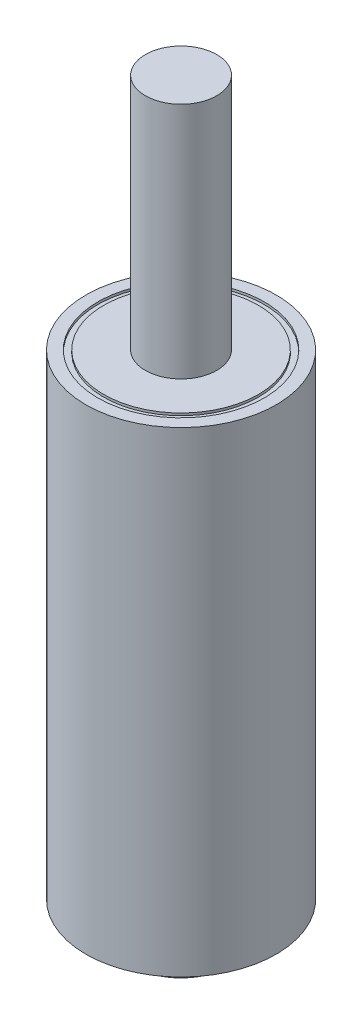
ISO-10303-21;
HEADER;
FILE_DESCRIPTION(('STEP AP214'),'2;1');
FILE_NAME('part.step','',(''),(''),'','','');
FILE_SCHEMA(('AUTOMOTIVE_DESIGN { 1 0 10303 214 1 1 1 1 }'));
ENDSEC;
DATA;
#1=APPLICATION_CONTEXT('core data for automotive mechanical design processes');
#2=APPLICATION_PROTOCOL_DEFINITION('international standard','automotive_design',2000,#1);
#3=PRODUCT_CONTEXT('',#1,'mechanical');
#4=PRODUCT('Part','Part','',(#3));
#5=PRODUCT_RELATED_PRODUCT_CATEGORY('part','',(#4));
#6=PRODUCT_DEFINITION_FORMATION('','',#4);
#7=PRODUCT_DEFINITION_CONTEXT('part definition',#1,'design');
#8=PRODUCT_DEFINITION('design','',#6,#7);
#9=PRODUCT_DEFINITION_SHAPE('','',#8);
#10=(LENGTH_UNIT() NAMED_UNIT(*) SI_UNIT(.MILLI.,.METRE.));
#11=(NAMED_UNIT(*) PLANE_ANGLE_UNIT() SI_UNIT($,.RADIAN.));
#12=(NAMED_UNIT(*) SI_UNIT($,.STERADIAN.) SOLID_ANGLE_UNIT());
#13=UNCERTAINTY_MEASURE_WITH_UNIT(LENGTH_MEASURE(1.E-05),#10,'distance_accuracy_value','');
#14=(GEOMETRIC_REPRESENTATION_CONTEXT(3) GLOBAL_UNCERTAINTY_ASSIGNED_CONTEXT((#13)) GLOBAL_UNIT_ASSIGNED_CONTEXT((#10,
#11,#12)) REPRESENTATION_CONTEXT('',''));
#15=CARTESIAN_POINT('',(0.,0.,0.));
#16=DIRECTION('',(0.,0.,1.));
#17=DIRECTION('',(1.,0.,0.));
#18=AXIS2_PLACEMENT_3D('',#15,#16,#17);
#19=CARTESIAN_POINT('',(0.,20.,0.));
#20=DIRECTION('',(0.,1.,0.));
#21=DIRECTION('',(0.,0.,1.));
#22=AXIS2_PLACEMENT_3D('',#19,#20,#21);
#23=PLANE('',#22);
#24=CARTESIAN_POINT('',(0.,20.,0.));
#25=DIRECTION('',(0.,1.,0.));
#26=DIRECTION('',(0.,0.,1.));
#27=AXIS2_PLACEMENT_3D('',#24,#25,#26);
#28=CIRCLE('',#27,3.5);
#29=CARTESIAN_POINT('',(0.,20.,3.5));
#30=VERTEX_POINT('',#29);
#31=EDGE_CURVE('E210',#30,#30,#28,.T.);
#32=ORIENTED_EDGE('',*,*,#31,.F.);
#33=EDGE_LOOP('',(#32));
#34=FACE_BOUND('',#33,.T.);
#35=CARTESIAN_POINT('',(0.,20.,0.));
#36=DIRECTION('',(0.,1.,0.));
#37=DIRECTION('',(0.,0.,1.));
#38=AXIS2_PLACEMENT_3D('',#35,#36,#37);
#39=CIRCLE('',#38,4.);
#40=CARTESIAN_POINT('',(0.,20.,4.));
#41=VERTEX_POINT('',#40);
#42=EDGE_CURVE('E141',#41,#41,#39,.T.);
#43=ORIENTED_EDGE('',*,*,#42,.T.);
#44=EDGE_LOOP('',(#43));
#45=FACE_BOUND('',#44,.T.);
#46=ADVANCED_FACE('F48',(#34,#45),#23,.T.);
#47=CARTESIAN_POINT('',(0.,-1.2,0.));
#48=DIRECTION('',(0.,-1.,0.));
#49=DIRECTION('',(0.,0.,-1.));
#50=AXIS2_PLACEMENT_3D('',#47,#48,#49);
#51=PLANE('',#50);
#52=CARTESIAN_POINT('',(0.,-1.2,0.));
#53=DIRECTION('',(0.,-1.,0.));
#54=DIRECTION('',(0.,0.,-1.));
#55=AXIS2_PLACEMENT_3D('',#52,#53,#54);
#56=CIRCLE('',#55,1.25);
#57=CARTESIAN_POINT('',(0.,-1.2,-1.25));
#58=VERTEX_POINT('',#57);
#59=CARTESIAN_POINT('',(1.25,-1.2,0.));
#60=VERTEX_POINT('',#59);
#61=EDGE_CURVE('E117',#58,#60,#56,.T.);
#62=ORIENTED_EDGE('',*,*,#61,.F.);
#63=DIRECTION('',(0.,0.,1.));
#64=VECTOR('',#63,1.);
#65=CARTESIAN_POINT('',(0.,-1.2,-1.25));
#66=LINE('',#65,#64);
#67=CARTESIAN_POINT('',(0.,-1.2,-1.9));
#68=VERTEX_POINT('',#67);
#69=EDGE_CURVE('E226',#68,#58,#66,.T.);
#70=ORIENTED_EDGE('',*,*,#69,.F.);
#71=CARTESIAN_POINT('',(0.,-1.2,0.));
#72=DIRECTION('',(0.,-1.,0.));
#73=DIRECTION('',(0.,0.,-1.));
#74=AXIS2_PLACEMENT_3D('',#71,#72,#73);
#75=CIRCLE('',#74,1.9);
#76=CARTESIAN_POINT('',(1.9,-1.2,0.));
#77=VERTEX_POINT('',#76);
#78=EDGE_CURVE('E155',#68,#77,#75,.T.);
#79=ORIENTED_EDGE('',*,*,#78,.T.);
#80=DIRECTION('',(1.,0.,0.));
#81=VECTOR('',#80,1.);
#82=CARTESIAN_POINT('',(1.25,-1.2,0.));
#83=LINE('',#82,#81);
#84=EDGE_CURVE('E111',#60,#77,#83,.T.);
#85=ORIENTED_EDGE('',*,*,#84,.F.);
#86=EDGE_LOOP('',(#62,#70,#79,#85));
#87=FACE_BOUND('',#86,.T.);
#88=ADVANCED_FACE('F176',(#87),#51,.T.);
#89=CARTESIAN_POINT('',(0.,-1.7,0.));
#90=DIRECTION('',(0.,1.,0.));
#91=DIRECTION('',(0.,0.,1.));
#92=AXIS2_PLACEMENT_3D('',#89,#90,#91);
#93=CYLINDRICAL_SURFACE('',#92,1.25);
#94=CARTESIAN_POINT('',(0.,-1.5,0.));
#95=DIRECTION('',(0.,-1.,0.));
#96=DIRECTION('',(0.,0.,-1.));
#97=AXIS2_PLACEMENT_3D('',#94,#95,#96);
#98=CIRCLE('',#97,1.25);
#99=CARTESIAN_POINT('',(0.,-1.5,-1.25));
#100=VERTEX_POINT('',#99);
#101=EDGE_CURVE('E12',#100,#100,#98,.F.);
#102=ORIENTED_EDGE('',*,*,#101,.T.);
#103=EDGE_LOOP('',(#102));
#104=FACE_BOUND('',#103,.T.);
#105=DIRECTION('',(0.,1.,0.));
#106=VECTOR('',#105,1.);
#107=CARTESIAN_POINT('',(0.,-1.45,-1.25));
#108=LINE('',#107,#106);
#109=CARTESIAN_POINT('',(0.,-1.45,-1.25));
#110=VERTEX_POINT('',#109);
#111=EDGE_CURVE('E63',#110,#58,#108,.T.);
#112=ORIENTED_EDGE('',*,*,#111,.T.);
#113=ORIENTED_EDGE('',*,*,#61,.T.);
#114=DIRECTION('',(0.,1.,0.));
#115=VECTOR('',#114,1.);
#116=CARTESIAN_POINT('',(1.25,-1.45,0.));
#117=LINE('',#116,#115);
#118=CARTESIAN_POINT('',(1.25,-1.45,0.));
#119=VERTEX_POINT('',#118);
#120=EDGE_CURVE('E119',#119,#60,#117,.T.);
#121=ORIENTED_EDGE('',*,*,#120,.F.);
#122=CARTESIAN_POINT('',(0.,-1.45,0.));
#123=DIRECTION('',(0.,1.,0.));
#124=DIRECTION('',(0.,0.,-1.));
#125=AXIS2_PLACEMENT_3D('',#122,#123,#124);
#126=CIRCLE('',#125,1.25);
#127=EDGE_CURVE('E101',#110,#119,#126,.T.);
#128=ORIENTED_EDGE('',*,*,#127,.F.);
#129=EDGE_LOOP('',(#112,#113,#121,#128));
#130=FACE_BOUND('',#129,.T.);
#131=ADVANCED_FACE('F183',(#104,#130),#93,.T.);
#132=CARTESIAN_POINT('',(0.,0.,0.));
#133=DIRECTION('',(0.,1.,0.));
#134=DIRECTION('',(0.,0.,1.));
#135=AXIS2_PLACEMENT_3D('',#132,#133,#134);
#136=PLANE('',#135);
#137=CARTESIAN_POINT('',(0.,0.,0.));
#138=DIRECTION('',(0.,-1.,0.));
#139=DIRECTION('',(1.,0.,0.));
#140=AXIS2_PLACEMENT_3D('',#137,#138,#139);
#141=CIRCLE('',#140,3.25);
#142=CARTESIAN_POINT('',(3.25,0.,0.));
#143=VERTEX_POINT('',#142);
#144=EDGE_CURVE('E128',#143,#143,#141,.T.);
#145=ORIENTED_EDGE('',*,*,#144,.T.);
#146=EDGE_LOOP('',(#145));
#147=FACE_BOUND('',#146,.T.);
#148=CARTESIAN_POINT('',(0.,0.,0.));
#149=DIRECTION('',(0.,1.,0.));
#150=DIRECTION('',(0.,0.,1.));
#151=AXIS2_PLACEMENT_3D('',#148,#149,#150);
#152=CIRCLE('',#151,2.);
#153=CARTESIAN_POINT('',(0.,0.,2.));
#154=VERTEX_POINT('',#153);
#155=EDGE_CURVE('E144',#154,#154,#152,.F.);
#156=ORIENTED_EDGE('',*,*,#155,.F.);
#157=EDGE_LOOP('',(#156));
#158=FACE_BOUND('',#157,.T.);
#159=ADVANCED_FACE('F241',(#147,#158),#136,.F.);
#160=CARTESIAN_POINT('',(0.,20.,0.));
#161=DIRECTION('',(0.,-1.,0.));
#162=DIRECTION('',(0.,0.,-1.));
#163=AXIS2_PLACEMENT_3D('',#160,#161,#162);
#164=CYLINDRICAL_SURFACE('',#163,4.);
#165=ORIENTED_EDGE('',*,*,#42,.F.);
#166=EDGE_LOOP('',(#165));
#167=FACE_BOUND('',#166,.T.);
#168=CARTESIAN_POINT('',(0.,0.,0.));
#169=DIRECTION('',(0.,1.,0.));
#170=DIRECTION('',(0.,0.,1.));
#171=AXIS2_PLACEMENT_3D('',#168,#169,#170);
#172=CIRCLE('',#171,4.);
#173=CARTESIAN_POINT('',(0.,0.,4.));
#174=VERTEX_POINT('',#173);
#175=EDGE_CURVE('E138',#174,#174,#172,.T.);
#176=ORIENTED_EDGE('',*,*,#175,.T.);
#177=EDGE_LOOP('',(#176));
#178=FACE_BOUND('',#177,.T.);
#179=ADVANCED_FACE('F247',(#167,#178),#164,.T.);
#180=CARTESIAN_POINT('',(0.,0.,0.));
#181=DIRECTION('',(0.,-1.,0.));
#182=DIRECTION('',(0.,0.,-1.));
#183=AXIS2_PLACEMENT_3D('',#180,#181,#182);
#184=CIRCLE('',#183,3.5);
#185=CARTESIAN_POINT('',(0.,0.,-3.5));
#186=VERTEX_POINT('',#185);
#187=EDGE_CURVE('E132',#186,#186,#184,.T.);
#188=ORIENTED_EDGE('',*,*,#187,.F.);
#189=EDGE_LOOP('',(#188));
#190=FACE_BOUND('',#189,.T.);
#191=ORIENTED_EDGE('',*,*,#175,.F.);
#192=EDGE_LOOP('',(#191));
#193=FACE_BOUND('',#192,.T.);
#194=ADVANCED_FACE('F249',(#190,#193),#136,.F.);
#195=CARTESIAN_POINT('',(0.,0.1,0.));
#196=DIRECTION('',(0.,-1.,0.));
#197=DIRECTION('',(0.,0.,-1.));
#198=AXIS2_PLACEMENT_3D('',#195,#196,#197);
#199=CYLINDRICAL_SURFACE('',#198,3.5);
#200=CARTESIAN_POINT('',(0.,0.1,0.));
#201=DIRECTION('',(0.,-1.,0.));
#202=DIRECTION('',(0.,0.,-1.));
#203=AXIS2_PLACEMENT_3D('',#200,#201,#202);
#204=CIRCLE('',#203,3.5);
#205=CARTESIAN_POINT('',(0.,0.1,-3.5));
#206=VERTEX_POINT('',#205);
#207=EDGE_CURVE('E135',#206,#206,#204,.T.);
#208=ORIENTED_EDGE('',*,*,#207,.F.);
#209=EDGE_LOOP('',(#208));
#210=FACE_BOUND('',#209,.T.);
#211=ORIENTED_EDGE('',*,*,#187,.T.);
#212=EDGE_LOOP('',(#211));
#213=FACE_BOUND('',#212,.T.);
#214=ADVANCED_FACE('F270',(#210,#213),#199,.F.);
#215=CARTESIAN_POINT('',(0.,0.1,0.));
#216=DIRECTION('',(0.,-1.,0.));
#217=DIRECTION('',(0.,0.,-1.));
#218=AXIS2_PLACEMENT_3D('',#215,#216,#217);
#219=PLANE('',#218);
#220=CARTESIAN_POINT('',(0.,0.1,0.));
#221=DIRECTION('',(0.,-1.,0.));
#222=DIRECTION('',(1.,0.,0.));
#223=AXIS2_PLACEMENT_3D('',#220,#221,#222);
#224=CIRCLE('',#223,3.25);
#225=CARTESIAN_POINT('',(3.25,0.1,0.));
#226=VERTEX_POINT('',#225);
#227=EDGE_CURVE('E129',#226,#226,#224,.T.);
#228=ORIENTED_EDGE('',*,*,#227,.F.);
#229=EDGE_LOOP('',(#228));
#230=FACE_BOUND('',#229,.T.);
#231=ORIENTED_EDGE('',*,*,#207,.T.);
#232=EDGE_LOOP('',(#231));
#233=FACE_BOUND('',#232,.T.);
#234=ADVANCED_FACE('F267',(#230,#233),#219,.T.);
#235=CARTESIAN_POINT('',(0.,0.1,0.));
#236=DIRECTION('',(0.,-1.,0.));
#237=DIRECTION('',(0.,0.,-1.));
#238=AXIS2_PLACEMENT_3D('',#235,#236,#237);
#239=CYLINDRICAL_SURFACE('',#238,3.25);
#240=ORIENTED_EDGE('',*,*,#227,.T.);
#241=EDGE_LOOP('',(#240));
#242=FACE_BOUND('',#241,.T.);
#243=ORIENTED_EDGE('',*,*,#144,.F.);
#244=EDGE_LOOP('',(#243));
#245=FACE_BOUND('',#244,.T.);
#246=ADVANCED_FACE('F263',(#242,#245),#239,.T.);
#247=CARTESIAN_POINT('',(0.,-0.2,0.));
#248=DIRECTION('',(0.,1.,0.));
#249=DIRECTION('',(0.,0.,1.));
#250=AXIS2_PLACEMENT_3D('',#247,#248,#249);
#251=CYLINDRICAL_SURFACE('',#250,2.);
#252=CARTESIAN_POINT('',(0.,-0.1,0.));
#253=DIRECTION('',(0.,-1.,0.));
#254=DIRECTION('',(0.,0.,-1.));
#255=AXIS2_PLACEMENT_3D('',#252,#253,#254);
#256=CIRCLE('',#255,2.);
#257=CARTESIAN_POINT('',(0.,-0.1,-2.));
#258=VERTEX_POINT('',#257);
#259=EDGE_CURVE('E152',#258,#258,#256,.F.);
#260=ORIENTED_EDGE('',*,*,#259,.T.);
#261=EDGE_LOOP('',(#260));
#262=FACE_BOUND('',#261,.T.);
#263=ORIENTED_EDGE('',*,*,#155,.T.);
#264=EDGE_LOOP('',(#263));
#265=FACE_BOUND('',#264,.T.);
#266=ADVANCED_FACE('F260',(#262,#265),#251,.T.);
#267=CARTESIAN_POINT('',(0.,-0.1,0.));
#268=DIRECTION('',(0.,-1.,0.));
#269=DIRECTION('',(0.,0.,-1.));
#270=AXIS2_PLACEMENT_3D('',#267,#268,#269);
#271=TOROIDAL_SURFACE('',#270,1.9,0.1);
#272=ORIENTED_EDGE('',*,*,#259,.F.);
#273=EDGE_LOOP('',(#272));
#274=FACE_BOUND('',#273,.T.);
#275=CARTESIAN_POINT('',(0.,-0.2,0.));
#276=DIRECTION('',(0.,-1.,0.));
#277=DIRECTION('',(0.,0.,-1.));
#278=AXIS2_PLACEMENT_3D('',#275,#276,#277);
#279=CIRCLE('',#278,1.9);
#280=CARTESIAN_POINT('',(0.,-0.2,-1.9));
#281=VERTEX_POINT('',#280);
#282=EDGE_CURVE('E149',#281,#281,#279,.T.);
#283=ORIENTED_EDGE('',*,*,#282,.F.);
#284=EDGE_LOOP('',(#283));
#285=FACE_BOUND('',#284,.T.);
#286=ADVANCED_FACE('F258',(#274,#285),#271,.T.);
#287=CARTESIAN_POINT('',(0.,-1.2,0.));
#288=DIRECTION('',(0.,1.,0.));
#289=DIRECTION('',(0.,0.,1.));
#290=AXIS2_PLACEMENT_3D('',#287,#288,#289);
#291=CYLINDRICAL_SURFACE('',#290,2.);
#292=CARTESIAN_POINT('',(0.,-1.1,0.));
#293=DIRECTION('',(0.,-1.,0.));
#294=DIRECTION('',(0.,0.,-1.));
#295=AXIS2_PLACEMENT_3D('',#292,#293,#294);
#296=CIRCLE('',#295,2.);
#297=CARTESIAN_POINT('',(0.,-1.1,-2.));
#298=VERTEX_POINT('',#297);
#299=EDGE_CURVE('E158',#298,#298,#296,.F.);
#300=ORIENTED_EDGE('',*,*,#299,.T.);
#301=EDGE_LOOP('',(#300));
#302=FACE_BOUND('',#301,.T.);
#303=CARTESIAN_POINT('',(0.,-0.2,0.));
#304=DIRECTION('',(0.,-1.,0.));
#305=DIRECTION('',(0.,0.,-1.));
#306=AXIS2_PLACEMENT_3D('',#303,#304,#305);
#307=CIRCLE('',#306,2.);
#308=CARTESIAN_POINT('',(0.,-0.2,-2.));
#309=VERTEX_POINT('',#308);
#310=EDGE_CURVE('E125',#309,#309,#307,.T.);
#311=ORIENTED_EDGE('',*,*,#310,.T.);
#312=EDGE_LOOP('',(#311));
#313=FACE_BOUND('',#312,.T.);
#314=ADVANCED_FACE('F254',(#302,#313),#291,.T.);
#315=CARTESIAN_POINT('',(0.,-0.2,0.));
#316=DIRECTION('',(0.,-1.,0.));
#317=DIRECTION('',(0.,0.,-1.));
#318=AXIS2_PLACEMENT_3D('',#315,#316,#317);
#319=PLANE('',#318);
#320=ORIENTED_EDGE('',*,*,#282,.T.);
#321=EDGE_LOOP('',(#320));
#322=FACE_BOUND('',#321,.T.);
#323=ORIENTED_EDGE('',*,*,#310,.F.);
#324=EDGE_LOOP('',(#323));
#325=FACE_BOUND('',#324,.T.);
#326=ADVANCED_FACE('F251',(#322,#325),#319,.F.);
#327=CARTESIAN_POINT('',(0.,-1.1,0.));
#328=DIRECTION('',(0.,-1.,0.));
#329=DIRECTION('',(0.,0.,-1.));
#330=AXIS2_PLACEMENT_3D('',#327,#328,#329);
#331=TOROIDAL_SURFACE('',#330,1.9,0.1);
#332=ORIENTED_EDGE('',*,*,#299,.F.);
#333=EDGE_LOOP('',(#332));
#334=FACE_BOUND('',#333,.T.);
#335=ORIENTED_EDGE('',*,*,#78,.F.);
#336=CARTESIAN_POINT('',(0.,-1.2,0.));
#337=DIRECTION('',(0.,-1.,0.));
#338=DIRECTION('',(0.,0.,-1.));
#339=AXIS2_PLACEMENT_3D('',#336,#337,#338);
#340=CIRCLE('',#339,1.9);
#341=EDGE_CURVE('E71',#68,#77,#340,.F.);
#342=ORIENTED_EDGE('',*,*,#341,.T.);
#343=EDGE_LOOP('',(#335,#342));
#344=FACE_BOUND('',#343,.T.);
#345=ADVANCED_FACE('F172',(#334,#344),#331,.T.);
#346=CARTESIAN_POINT('',(0.,-1.7,0.));
#347=DIRECTION('',(0.,-1.,0.));
#348=DIRECTION('',(0.,0.,-1.));
#349=AXIS2_PLACEMENT_3D('',#346,#347,#348);
#350=PLANE('',#349);
#351=CARTESIAN_POINT('',(0.,-1.7,0.));
#352=DIRECTION('',(0.,-1.,0.));
#353=DIRECTION('',(0.,0.,-1.));
#354=AXIS2_PLACEMENT_3D('',#351,#352,#353);
#355=CIRCLE('',#354,1.05);
#356=CARTESIAN_POINT('',(0.,-1.7,-1.05));
#357=VERTEX_POINT('',#356);
#358=EDGE_CURVE('E56',#357,#357,#355,.T.);
#359=ORIENTED_EDGE('',*,*,#358,.T.);
#360=EDGE_LOOP('',(#359));
#361=FACE_BOUND('',#360,.T.);
#362=ADVANCED_FACE('F163',(#361),#350,.T.);
#363=CARTESIAN_POINT('',(0.,-1.7,0.));
#364=DIRECTION('',(0.,1.,0.));
#365=DIRECTION('',(0.,0.,1.));
#366=AXIS2_PLACEMENT_3D('',#363,#364,#365);
#367=CONICAL_SURFACE('',#366,1.05,0.785398163397447);
#368=ORIENTED_EDGE('',*,*,#101,.F.);
#369=EDGE_LOOP('',(#368));
#370=FACE_BOUND('',#369,.T.);
#371=ORIENTED_EDGE('',*,*,#358,.F.);
#372=EDGE_LOOP('',(#371));
#373=FACE_BOUND('',#372,.T.);
#374=ADVANCED_FACE('F50',(#370,#373),#367,.T.);
#375=CARTESIAN_POINT('',(0.,-1.45,0.));
#376=DIRECTION('',(0.,1.,0.));
#377=DIRECTION('',(0.,0.,1.));
#378=AXIS2_PLACEMENT_3D('',#375,#376,#377);
#379=CYLINDRICAL_SURFACE('',#378,2.);
#380=CARTESIAN_POINT('',(0.,-1.2,0.));
#381=DIRECTION('',(0.,-1.,0.));
#382=DIRECTION('',(0.,0.,-1.));
#383=AXIS2_PLACEMENT_3D('',#380,#381,#382);
#384=CIRCLE('',#383,2.);
#385=CARTESIAN_POINT('',(2.,-1.2,0.));
#386=VERTEX_POINT('',#385);
#387=CARTESIAN_POINT('',(0.,-1.2,-2.));
#388=VERTEX_POINT('',#387);
#389=EDGE_CURVE('E115',#386,#388,#384,.T.);
#390=ORIENTED_EDGE('',*,*,#389,.T.);
#391=DIRECTION('',(0.,1.,0.));
#392=VECTOR('',#391,1.);
#393=CARTESIAN_POINT('',(0.,-1.45,-2.));
#394=LINE('',#393,#392);
#395=CARTESIAN_POINT('',(0.,-1.45,-2.));
#396=VERTEX_POINT('',#395);
#397=EDGE_CURVE('E97',#396,#388,#394,.T.);
#398=ORIENTED_EDGE('',*,*,#397,.F.);
#399=CARTESIAN_POINT('',(0.,-1.45,0.));
#400=DIRECTION('',(0.,-1.,0.));
#401=DIRECTION('',(0.,0.,-1.));
#402=AXIS2_PLACEMENT_3D('',#399,#400,#401);
#403=CIRCLE('',#402,2.);
#404=CARTESIAN_POINT('',(2.,-1.45,0.));
#405=VERTEX_POINT('',#404);
#406=EDGE_CURVE('E102',#405,#396,#403,.T.);
#407=ORIENTED_EDGE('',*,*,#406,.F.);
#408=DIRECTION('',(0.,1.,0.));
#409=VECTOR('',#408,1.);
#410=CARTESIAN_POINT('',(2.,-1.45,0.));
#411=LINE('',#410,#409);
#412=EDGE_CURVE('E224',#405,#386,#411,.T.);
#413=ORIENTED_EDGE('',*,*,#412,.T.);
#414=EDGE_LOOP('',(#390,#398,#407,#413));
#415=FACE_BOUND('',#414,.T.);
#416=ADVANCED_FACE('F113',(#415),#379,.T.);
#417=CARTESIAN_POINT('',(0.,-1.45,-1.25));
#418=DIRECTION('',(-1.,0.,0.));
#419=DIRECTION('',(0.,0.,1.));
#420=AXIS2_PLACEMENT_3D('',#417,#418,#419);
#421=PLANE('',#420);
#422=EDGE_CURVE('E227',#388,#68,#66,.T.);
#423=ORIENTED_EDGE('',*,*,#422,.T.);
#424=ORIENTED_EDGE('',*,*,#69,.T.);
#425=ORIENTED_EDGE('',*,*,#111,.F.);
#426=DIRECTION('',(0.,0.,1.));
#427=VECTOR('',#426,1.);
#428=CARTESIAN_POINT('',(0.,-1.45,-1.25));
#429=LINE('',#428,#427);
#430=EDGE_CURVE('E93',#396,#110,#429,.T.);
#431=ORIENTED_EDGE('',*,*,#430,.F.);
#432=ORIENTED_EDGE('',*,*,#397,.T.);
#433=EDGE_LOOP('',(#423,#424,#425,#431,#432));
#434=FACE_BOUND('',#433,.T.);
#435=ADVANCED_FACE('F95',(#434),#421,.F.);
#436=CARTESIAN_POINT('',(1.25,-1.45,0.));
#437=DIRECTION('',(0.,0.,1.));
#438=DIRECTION('',(1.,0.,0.));
#439=AXIS2_PLACEMENT_3D('',#436,#437,#438);
#440=PLANE('',#439);
#441=ORIENTED_EDGE('',*,*,#84,.T.);
#442=EDGE_CURVE('E229',#77,#386,#83,.T.);
#443=ORIENTED_EDGE('',*,*,#442,.T.);
#444=ORIENTED_EDGE('',*,*,#412,.F.);
#445=DIRECTION('',(1.,0.,0.));
#446=VECTOR('',#445,1.);
#447=CARTESIAN_POINT('',(1.25,-1.45,0.));
#448=LINE('',#447,#446);
#449=EDGE_CURVE('E107',#119,#405,#448,.T.);
#450=ORIENTED_EDGE('',*,*,#449,.F.);
#451=ORIENTED_EDGE('',*,*,#120,.T.);
#452=EDGE_LOOP('',(#441,#443,#444,#450,#451));
#453=FACE_BOUND('',#452,.T.);
#454=ADVANCED_FACE('F235',(#453),#440,.F.);
#455=CARTESIAN_POINT('',(0.,-1.45,0.));
#456=DIRECTION('',(0.,-1.,0.));
#457=DIRECTION('',(0.,0.,-1.));
#458=AXIS2_PLACEMENT_3D('',#455,#456,#457);
#459=PLANE('',#458);
#460=ORIENTED_EDGE('',*,*,#406,.T.);
#461=ORIENTED_EDGE('',*,*,#430,.T.);
#462=ORIENTED_EDGE('',*,*,#127,.T.);
#463=ORIENTED_EDGE('',*,*,#449,.T.);
#464=EDGE_LOOP('',(#460,#461,#462,#463));
#465=FACE_BOUND('',#464,.T.);
#466=ADVANCED_FACE('F105',(#465),#459,.T.);
#467=CARTESIAN_POINT('',(0.,-1.2,0.));
#468=DIRECTION('',(0.,-1.,0.));
#469=DIRECTION('',(0.,0.,-1.));
#470=AXIS2_PLACEMENT_3D('',#467,#468,#469);
#471=PLANE('',#470);
#472=ORIENTED_EDGE('',*,*,#341,.F.);
#473=ORIENTED_EDGE('',*,*,#422,.F.);
#474=ORIENTED_EDGE('',*,*,#389,.F.);
#475=ORIENTED_EDGE('',*,*,#442,.F.);
#476=EDGE_LOOP('',(#472,#473,#474,#475));
#477=FACE_BOUND('',#476,.T.);
#478=ADVANCED_FACE('F363',(#477),#471,.F.);
#479=CARTESIAN_POINT('',(0.,19.9,0.));
#480=DIRECTION('',(0.,1.,0.));
#481=DIRECTION('',(0.,0.,1.));
#482=AXIS2_PLACEMENT_3D('',#479,#480,#481);
#483=CYLINDRICAL_SURFACE('',#482,3.5);
#484=CARTESIAN_POINT('',(0.,19.9,0.));
#485=DIRECTION('',(0.,1.,0.));
#486=DIRECTION('',(0.,0.,1.));
#487=AXIS2_PLACEMENT_3D('',#484,#485,#486);
#488=CIRCLE('',#487,3.5);
#489=CARTESIAN_POINT('',(0.,19.9,3.5));
#490=VERTEX_POINT('',#489);
#491=EDGE_CURVE('E213',#490,#490,#488,.T.);
#492=ORIENTED_EDGE('',*,*,#491,.F.);
#493=EDGE_LOOP('',(#492));
#494=FACE_BOUND('',#493,.T.);
#495=ORIENTED_EDGE('',*,*,#31,.T.);
#496=EDGE_LOOP('',(#495));
#497=FACE_BOUND('',#496,.T.);
#498=ADVANCED_FACE('F372',(#494,#497),#483,.F.);
#499=CARTESIAN_POINT('',(0.,19.9,0.));
#500=DIRECTION('',(0.,1.,0.));
#501=DIRECTION('',(0.,0.,1.));
#502=AXIS2_PLACEMENT_3D('',#499,#500,#501);
#503=PLANE('',#502);
#504=CARTESIAN_POINT('',(0.,19.9,0.));
#505=DIRECTION('',(0.,1.,0.));
#506=DIRECTION('',(1.,0.,0.));
#507=AXIS2_PLACEMENT_3D('',#504,#505,#506);
#508=CIRCLE('',#507,3.25);
#509=CARTESIAN_POINT('',(3.25,19.9,0.));
#510=VERTEX_POINT('',#509);
#511=EDGE_CURVE('E207',#510,#510,#508,.T.);
#512=ORIENTED_EDGE('',*,*,#511,.F.);
#513=EDGE_LOOP('',(#512));
#514=FACE_BOUND('',#513,.T.);
#515=ORIENTED_EDGE('',*,*,#491,.T.);
#516=EDGE_LOOP('',(#515));
#517=FACE_BOUND('',#516,.T.);
#518=ADVANCED_FACE('F403',(#514,#517),#503,.T.);
#519=CARTESIAN_POINT('',(0.,19.9,0.));
#520=DIRECTION('',(0.,1.,0.));
#521=DIRECTION('',(0.,0.,1.));
#522=AXIS2_PLACEMENT_3D('',#519,#520,#521);
#523=CYLINDRICAL_SURFACE('',#522,3.25);
#524=ORIENTED_EDGE('',*,*,#511,.T.);
#525=EDGE_LOOP('',(#524));
#526=FACE_BOUND('',#525,.T.);
#527=CARTESIAN_POINT('',(0.,20.,0.));
#528=DIRECTION('',(0.,1.,0.));
#529=DIRECTION('',(1.,0.,0.));
#530=AXIS2_PLACEMENT_3D('',#527,#528,#529);
#531=CIRCLE('',#530,3.25);
#532=CARTESIAN_POINT('',(3.25,20.,0.));
#533=VERTEX_POINT('',#532);
#534=EDGE_CURVE('E205',#533,#533,#531,.T.);
#535=ORIENTED_EDGE('',*,*,#534,.F.);
#536=EDGE_LOOP('',(#535));
#537=FACE_BOUND('',#536,.T.);
#538=ADVANCED_FACE('F388',(#526,#537),#523,.T.);
#539=CARTESIAN_POINT('',(0.,30.,0.));
#540=DIRECTION('',(0.,1.,0.));
#541=DIRECTION('',(0.,0.,1.));
#542=AXIS2_PLACEMENT_3D('',#539,#540,#541);
#543=PLANE('',#542);
#544=CARTESIAN_POINT('',(0.,30.,0.));
#545=DIRECTION('',(0.,1.,0.));
#546=DIRECTION('',(0.,0.,1.));
#547=AXIS2_PLACEMENT_3D('',#544,#545,#546);
#548=CIRCLE('',#547,1.5);
#549=CARTESIAN_POINT('',(0.,30.,1.5));
#550=VERTEX_POINT('',#549);
#551=EDGE_CURVE('E218',#550,#550,#548,.T.);
#552=ORIENTED_EDGE('',*,*,#551,.T.);
#553=EDGE_LOOP('',(#552));
#554=FACE_BOUND('',#553,.T.);
#555=ADVANCED_FACE('F196',(#554),#543,.T.);
#556=CARTESIAN_POINT('',(0.,30.,0.));
#557=DIRECTION('',(0.,-1.,0.));
#558=DIRECTION('',(0.,0.,-1.));
#559=AXIS2_PLACEMENT_3D('',#556,#557,#558);
#560=CYLINDRICAL_SURFACE('',#559,1.5);
#561=ORIENTED_EDGE('',*,*,#551,.F.);
#562=EDGE_LOOP('',(#561));
#563=FACE_BOUND('',#562,.T.);
#564=CARTESIAN_POINT('',(0.,20.,0.));
#565=DIRECTION('',(0.,1.,0.));
#566=DIRECTION('',(0.,0.,1.));
#567=AXIS2_PLACEMENT_3D('',#564,#565,#566);
#568=CIRCLE('',#567,1.5);
#569=CARTESIAN_POINT('',(0.,20.,1.5));
#570=VERTEX_POINT('',#569);
#571=EDGE_CURVE('E202',#570,#570,#568,.T.);
#572=ORIENTED_EDGE('',*,*,#571,.T.);
#573=EDGE_LOOP('',(#572));
#574=FACE_BOUND('',#573,.T.);
#575=ADVANCED_FACE('F191',(#563,#574),#560,.T.);
#576=ORIENTED_EDGE('',*,*,#571,.F.);
#577=EDGE_LOOP('',(#576));
#578=FACE_BOUND('',#577,.T.);
#579=ORIENTED_EDGE('',*,*,#534,.T.);
#580=EDGE_LOOP('',(#579));
#581=FACE_BOUND('',#580,.T.);
#582=ADVANCED_FACE('F179',(#578,#581),#23,.T.);
#583=CLOSED_SHELL('',(#46,#88,#131,#159,#179,#194,#214,#234,#246,#266,#286,#314,#326,#345,#362,
#374,#416,#435,#454,#466,#478,#498,#518,#538,#555,#575,#582));
#584=MANIFOLD_SOLID_BREP('B2',#583);
#585=ADVANCED_BREP_SHAPE_REPRESENTATION('',(#18,#584),#14);
#586=SHAPE_DEFINITION_REPRESENTATION(#9,#585);
ENDSEC;
END-ISO-10303-21;
